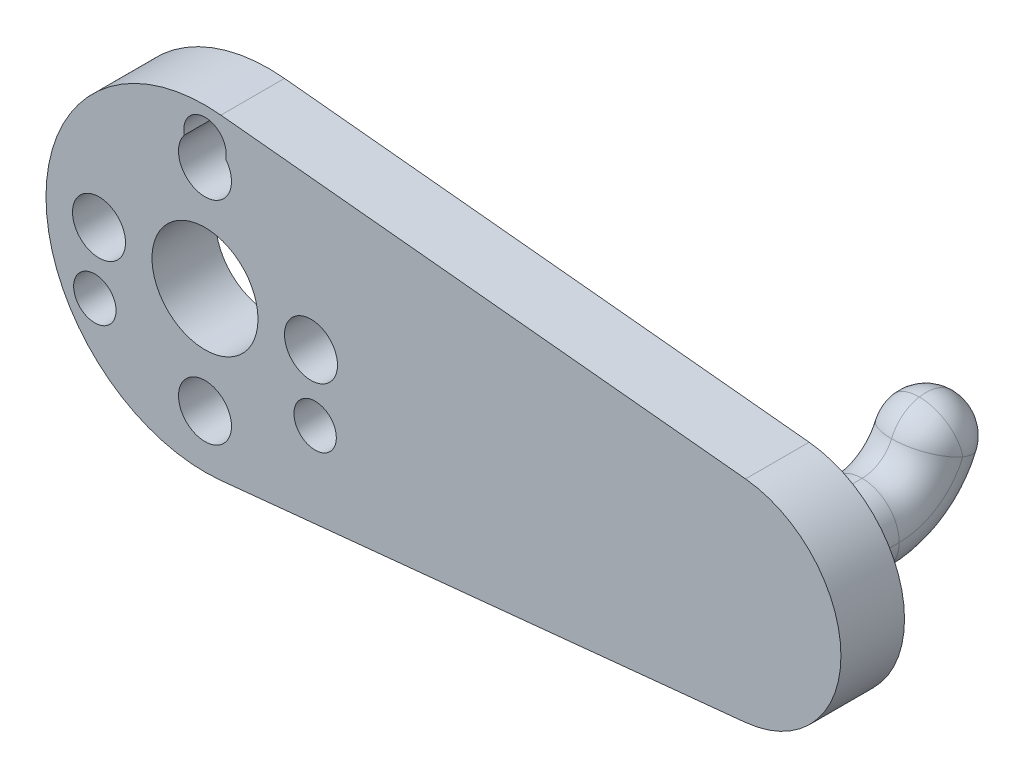
ISO-10303-21;
HEADER;
FILE_DESCRIPTION(('STEP AP214'),'2;1');
FILE_NAME('part.step','',(''),(''),'','','');
FILE_SCHEMA(('AUTOMOTIVE_DESIGN { 1 0 10303 214 1 1 1 1 }'));
ENDSEC;
DATA;
#1=APPLICATION_CONTEXT('core data for automotive mechanical design processes');
#2=APPLICATION_PROTOCOL_DEFINITION('international standard','automotive_design',2000,#1);
#3=PRODUCT_CONTEXT('',#1,'mechanical');
#4=PRODUCT('Part','Part','',(#3));
#5=PRODUCT_RELATED_PRODUCT_CATEGORY('part','',(#4));
#6=PRODUCT_DEFINITION_FORMATION('','',#4);
#7=PRODUCT_DEFINITION_CONTEXT('part definition',#1,'design');
#8=PRODUCT_DEFINITION('design','',#6,#7);
#9=PRODUCT_DEFINITION_SHAPE('','',#8);
#10=(LENGTH_UNIT() NAMED_UNIT(*) SI_UNIT(.MILLI.,.METRE.));
#11=(NAMED_UNIT(*) PLANE_ANGLE_UNIT() SI_UNIT($,.RADIAN.));
#12=(NAMED_UNIT(*) SI_UNIT($,.STERADIAN.) SOLID_ANGLE_UNIT());
#13=UNCERTAINTY_MEASURE_WITH_UNIT(LENGTH_MEASURE(1.E-05),#10,'distance_accuracy_value','');
#14=(GEOMETRIC_REPRESENTATION_CONTEXT(3) GLOBAL_UNCERTAINTY_ASSIGNED_CONTEXT((#13)) GLOBAL_UNIT_ASSIGNED_CONTEXT((#10,
#11,#12)) REPRESENTATION_CONTEXT('',''));
#15=CARTESIAN_POINT('',(0.,0.,0.));
#16=DIRECTION('',(0.,0.,1.));
#17=DIRECTION('',(1.,0.,0.));
#18=AXIS2_PLACEMENT_3D('',#15,#16,#17);
#19=CARTESIAN_POINT('',(0.,0.,0.));
#20=DIRECTION('',(0.,0.,1.));
#21=DIRECTION('',(1.,0.,0.));
#22=AXIS2_PLACEMENT_3D('',#19,#20,#21);
#23=PLANE('',#22);
#24=CARTESIAN_POINT('',(-5.1961524227065,-3.00000000000022,0.));
#25=DIRECTION('',(0.,0.,1.));
#26=DIRECTION('',(1.,0.,0.));
#27=AXIS2_PLACEMENT_3D('',#24,#25,#26);
#28=CIRCLE('',#27,1.00000000000048);
#29=CARTESIAN_POINT('',(-4.19615242270602,-3.00000000000022,0.));
#30=VERTEX_POINT('',#29);
#31=EDGE_CURVE('E243',#30,#30,#28,.T.);
#32=ORIENTED_EDGE('',*,*,#31,.T.);
#33=EDGE_LOOP('',(#32));
#34=FACE_BOUND('',#33,.T.);
#35=CARTESIAN_POINT('',(5.19615242270676,-2.99999999999978,0.));
#36=DIRECTION('',(0.,0.,1.));
#37=DIRECTION('',(1.,0.,0.));
#38=AXIS2_PLACEMENT_3D('',#35,#36,#37);
#39=CIRCLE('',#38,1.00000000000033);
#40=CARTESIAN_POINT('',(6.19615242270709,-2.99999999999978,0.));
#41=VERTEX_POINT('',#40);
#42=EDGE_CURVE('E251',#41,#41,#39,.T.);
#43=ORIENTED_EDGE('',*,*,#42,.T.);
#44=EDGE_LOOP('',(#43));
#45=FACE_BOUND('',#44,.T.);
#46=CARTESIAN_POINT('',(-2.54353829665099E-13,6.,0.));
#47=DIRECTION('',(0.,0.,1.));
#48=DIRECTION('',(1.,0.,0.));
#49=AXIS2_PLACEMENT_3D('',#46,#47,#48);
#50=CIRCLE('',#49,1.);
#51=CARTESIAN_POINT('',(0.975780937249551,5.78125000000024,0.));
#52=VERTEX_POINT('',#51);
#53=CARTESIAN_POINT('',(-0.975780937249948,5.78124999999975,0.));
#54=VERTEX_POINT('',#53);
#55=EDGE_CURVE('E257',#52,#54,#50,.T.);
#56=ORIENTED_EDGE('',*,*,#55,.T.);
#57=CARTESIAN_POINT('',(0.,5.,0.));
#58=DIRECTION('',(0.,0.,1.));
#59=DIRECTION('',(1.,0.,0.));
#60=AXIS2_PLACEMENT_3D('',#57,#58,#59);
#61=CIRCLE('',#60,1.25);
#62=EDGE_CURVE('E111',#54,#52,#61,.T.);
#63=ORIENTED_EDGE('',*,*,#62,.T.);
#64=EDGE_LOOP('',(#56,#63));
#65=FACE_BOUND('',#64,.T.);
#66=CARTESIAN_POINT('',(0.,0.,0.));
#67=DIRECTION('',(0.,0.,1.));
#68=DIRECTION('',(1.,0.,0.));
#69=AXIS2_PLACEMENT_3D('',#66,#67,#68);
#70=CIRCLE('',#69,7.5);
#71=CARTESIAN_POINT('',(0.75,7.46240577829965,0.));
#72=VERTEX_POINT('',#71);
#73=CARTESIAN_POINT('',(0.75,-7.46240577829965,0.));
#74=VERTEX_POINT('',#73);
#75=EDGE_CURVE('E294',#72,#74,#70,.T.);
#76=ORIENTED_EDGE('',*,*,#75,.F.);
#77=DIRECTION('',(-0.99498743710662,0.1,0.));
#78=VECTOR('',#77,1.);
#79=CARTESIAN_POINT('',(0.75,7.46240577829965,0.));
#80=LINE('',#79,#78);
#81=CARTESIAN_POINT('',(25.5,4.9749371855331,0.));
#82=VERTEX_POINT('',#81);
#83=EDGE_CURVE('E301',#82,#72,#80,.T.);
#84=ORIENTED_EDGE('',*,*,#83,.F.);
#85=CARTESIAN_POINT('',(25.,0.,0.));
#86=DIRECTION('',(0.,0.,1.));
#87=DIRECTION('',(1.,0.,0.));
#88=AXIS2_PLACEMENT_3D('',#85,#86,#87);
#89=CIRCLE('',#88,5.);
#90=CARTESIAN_POINT('',(25.5,-4.9749371855331,0.));
#91=VERTEX_POINT('',#90);
#92=EDGE_CURVE('E312',#91,#82,#89,.T.);
#93=ORIENTED_EDGE('',*,*,#92,.F.);
#94=DIRECTION('',(0.99498743710662,0.1,0.));
#95=VECTOR('',#94,1.);
#96=CARTESIAN_POINT('',(0.75,-7.46240577829965,0.));
#97=LINE('',#96,#95);
#98=EDGE_CURVE('E310',#74,#91,#97,.T.);
#99=ORIENTED_EDGE('',*,*,#98,.F.);
#100=EDGE_LOOP('',(#76,#84,#93,#99));
#101=FACE_BOUND('',#100,.T.);
#102=CARTESIAN_POINT('',(0.,0.,0.));
#103=DIRECTION('',(0.,0.,1.));
#104=DIRECTION('',(1.,0.,0.));
#105=AXIS2_PLACEMENT_3D('',#102,#103,#104);
#106=CIRCLE('',#105,2.5);
#107=CARTESIAN_POINT('',(2.5,0.,0.));
#108=VERTEX_POINT('',#107);
#109=EDGE_CURVE('E288',#108,#108,#106,.T.);
#110=ORIENTED_EDGE('',*,*,#109,.T.);
#111=EDGE_LOOP('',(#110));
#112=FACE_BOUND('',#111,.T.);
#113=CARTESIAN_POINT('',(5.00000000000014,1.42247325030098E-13,0.));
#114=DIRECTION('',(0.,0.,1.));
#115=DIRECTION('',(1.,0.,0.));
#116=AXIS2_PLACEMENT_3D('',#113,#114,#115);
#117=CIRCLE('',#116,1.25);
#118=CARTESIAN_POINT('',(6.25000000000014,1.42247325030098E-13,0.));
#119=VERTEX_POINT('',#118);
#120=EDGE_CURVE('E282',#119,#119,#117,.T.);
#121=ORIENTED_EDGE('',*,*,#120,.T.);
#122=EDGE_LOOP('',(#121));
#123=FACE_BOUND('',#122,.T.);
#124=CARTESIAN_POINT('',(2.84494650060196E-13,-5.,0.));
#125=DIRECTION('',(0.,0.,1.));
#126=DIRECTION('',(1.,0.,0.));
#127=AXIS2_PLACEMENT_3D('',#124,#125,#126);
#128=CIRCLE('',#127,1.25);
#129=CARTESIAN_POINT('',(1.25000000000028,-5.,0.));
#130=VERTEX_POINT('',#129);
#131=EDGE_CURVE('E276',#130,#130,#128,.T.);
#132=ORIENTED_EDGE('',*,*,#131,.T.);
#133=EDGE_LOOP('',(#132));
#134=FACE_BOUND('',#133,.T.);
#135=CARTESIAN_POINT('',(-4.99999999999986,-1.42247325030098E-13,0.));
#136=DIRECTION('',(0.,0.,1.));
#137=DIRECTION('',(1.,0.,0.));
#138=AXIS2_PLACEMENT_3D('',#135,#136,#137);
#139=CIRCLE('',#138,1.25);
#140=CARTESIAN_POINT('',(-3.74999999999986,-1.42247325030098E-13,0.));
#141=VERTEX_POINT('',#140);
#142=EDGE_CURVE('E272',#141,#141,#139,.T.);
#143=ORIENTED_EDGE('',*,*,#142,.T.);
#144=EDGE_LOOP('',(#143));
#145=FACE_BOUND('',#144,.T.);
#146=CARTESIAN_POINT('',(25.,0.,0.));
#147=DIRECTION('',(0.,0.,1.));
#148=DIRECTION('',(1.,0.,0.));
#149=AXIS2_PLACEMENT_3D('',#146,#147,#148);
#150=CIRCLE('',#149,3.5);
#151=CARTESIAN_POINT('',(25.,-3.5,0.));
#152=VERTEX_POINT('',#151);
#153=CARTESIAN_POINT('',(21.5,0.,0.));
#154=VERTEX_POINT('',#153);
#155=EDGE_CURVE('E11',#152,#154,#150,.F.);
#156=ORIENTED_EDGE('',*,*,#155,.F.);
#157=CARTESIAN_POINT('',(25.,0.,0.));
#158=DIRECTION('',(0.,0.,1.));
#159=DIRECTION('',(1.,0.,0.));
#160=AXIS2_PLACEMENT_3D('',#157,#158,#159);
#161=CIRCLE('',#160,3.5);
#162=CARTESIAN_POINT('',(28.5,0.,0.));
#163=VERTEX_POINT('',#162);
#164=EDGE_CURVE('E45',#163,#152,#161,.F.);
#165=ORIENTED_EDGE('',*,*,#164,.F.);
#166=CARTESIAN_POINT('',(25.,0.,0.));
#167=DIRECTION('',(0.,0.,1.));
#168=DIRECTION('',(1.,0.,0.));
#169=AXIS2_PLACEMENT_3D('',#166,#167,#168);
#170=CIRCLE('',#169,3.5);
#171=CARTESIAN_POINT('',(25.,3.5,0.));
#172=VERTEX_POINT('',#171);
#173=EDGE_CURVE('E152',#172,#163,#170,.F.);
#174=ORIENTED_EDGE('',*,*,#173,.F.);
#175=CARTESIAN_POINT('',(25.,0.,0.));
#176=DIRECTION('',(0.,0.,1.));
#177=DIRECTION('',(1.,0.,0.));
#178=AXIS2_PLACEMENT_3D('',#175,#176,#177);
#179=CIRCLE('',#178,3.5);
#180=EDGE_CURVE('E155',#154,#172,#179,.F.);
#181=ORIENTED_EDGE('',*,*,#180,.F.);
#182=EDGE_LOOP('',(#156,#165,#174,#181));
#183=FACE_BOUND('',#182,.T.);
#184=ADVANCED_FACE('F35',(#34,#45,#65,#101,#112,#123,#134,#145,#183),#23,.F.);
#185=CARTESIAN_POINT('',(0.,0.,3.));
#186=DIRECTION('',(0.,0.,1.));
#187=DIRECTION('',(1.,0.,0.));
#188=AXIS2_PLACEMENT_3D('',#185,#186,#187);
#189=PLANE('',#188);
#190=CARTESIAN_POINT('',(5.19615242270676,-2.99999999999978,3.));
#191=DIRECTION('',(0.,0.,1.));
#192=DIRECTION('',(1.,0.,0.));
#193=AXIS2_PLACEMENT_3D('',#190,#191,#192);
#194=CIRCLE('',#193,1.00000000000033);
#195=CARTESIAN_POINT('',(6.19615242270709,-2.99999999999978,3.));
#196=VERTEX_POINT('',#195);
#197=EDGE_CURVE('E254',#196,#196,#194,.T.);
#198=ORIENTED_EDGE('',*,*,#197,.F.);
#199=EDGE_LOOP('',(#198));
#200=FACE_BOUND('',#199,.T.);
#201=CARTESIAN_POINT('',(2.84494650060196E-13,-5.,3.));
#202=DIRECTION('',(0.,0.,1.));
#203=DIRECTION('',(1.,0.,0.));
#204=AXIS2_PLACEMENT_3D('',#201,#202,#203);
#205=CIRCLE('',#204,1.25);
#206=CARTESIAN_POINT('',(1.25000000000028,-5.,3.));
#207=VERTEX_POINT('',#206);
#208=EDGE_CURVE('E279',#207,#207,#205,.T.);
#209=ORIENTED_EDGE('',*,*,#208,.F.);
#210=EDGE_LOOP('',(#209));
#211=FACE_BOUND('',#210,.T.);
#212=CARTESIAN_POINT('',(0.,0.,3.));
#213=DIRECTION('',(0.,0.,1.));
#214=DIRECTION('',(1.,0.,0.));
#215=AXIS2_PLACEMENT_3D('',#212,#213,#214);
#216=CIRCLE('',#215,2.5);
#217=CARTESIAN_POINT('',(2.5,0.,3.));
#218=VERTEX_POINT('',#217);
#219=EDGE_CURVE('E291',#218,#218,#216,.T.);
#220=ORIENTED_EDGE('',*,*,#219,.F.);
#221=EDGE_LOOP('',(#220));
#222=FACE_BOUND('',#221,.T.);
#223=CARTESIAN_POINT('',(0.,0.,3.));
#224=DIRECTION('',(0.,0.,1.));
#225=DIRECTION('',(1.,0.,0.));
#226=AXIS2_PLACEMENT_3D('',#223,#224,#225);
#227=CIRCLE('',#226,7.5);
#228=CARTESIAN_POINT('',(0.75,7.46240577829965,3.));
#229=VERTEX_POINT('',#228);
#230=CARTESIAN_POINT('',(0.75,-7.46240577829965,3.));
#231=VERTEX_POINT('',#230);
#232=EDGE_CURVE('E297',#229,#231,#227,.T.);
#233=ORIENTED_EDGE('',*,*,#232,.T.);
#234=DIRECTION('',(0.99498743710662,0.1,0.));
#235=VECTOR('',#234,1.);
#236=CARTESIAN_POINT('',(0.75,-7.46240577829965,3.));
#237=LINE('',#236,#235);
#238=CARTESIAN_POINT('',(25.5,-4.9749371855331,3.));
#239=VERTEX_POINT('',#238);
#240=EDGE_CURVE('E300',#231,#239,#237,.T.);
#241=ORIENTED_EDGE('',*,*,#240,.T.);
#242=CARTESIAN_POINT('',(25.,0.,3.));
#243=DIRECTION('',(0.,0.,1.));
#244=DIRECTION('',(1.,0.,0.));
#245=AXIS2_PLACEMENT_3D('',#242,#243,#244);
#246=CIRCLE('',#245,5.);
#247=CARTESIAN_POINT('',(25.5,4.9749371855331,3.));
#248=VERTEX_POINT('',#247);
#249=EDGE_CURVE('E303',#239,#248,#246,.T.);
#250=ORIENTED_EDGE('',*,*,#249,.T.);
#251=DIRECTION('',(-0.99498743710662,0.1,0.));
#252=VECTOR('',#251,1.);
#253=CARTESIAN_POINT('',(0.75,7.46240577829965,3.));
#254=LINE('',#253,#252);
#255=EDGE_CURVE('E305',#248,#229,#254,.T.);
#256=ORIENTED_EDGE('',*,*,#255,.T.);
#257=EDGE_LOOP('',(#233,#241,#250,#256));
#258=FACE_BOUND('',#257,.T.);
#259=CARTESIAN_POINT('',(5.00000000000014,1.42247325030098E-13,3.));
#260=DIRECTION('',(0.,0.,1.));
#261=DIRECTION('',(1.,0.,0.));
#262=AXIS2_PLACEMENT_3D('',#259,#260,#261);
#263=CIRCLE('',#262,1.25);
#264=CARTESIAN_POINT('',(6.25000000000014,1.42247325030098E-13,3.));
#265=VERTEX_POINT('',#264);
#266=EDGE_CURVE('E285',#265,#265,#263,.T.);
#267=ORIENTED_EDGE('',*,*,#266,.F.);
#268=EDGE_LOOP('',(#267));
#269=FACE_BOUND('',#268,.T.);
#270=CARTESIAN_POINT('',(-4.99999999999986,-1.42247325030098E-13,3.));
#271=DIRECTION('',(0.,0.,1.));
#272=DIRECTION('',(1.,0.,0.));
#273=AXIS2_PLACEMENT_3D('',#270,#271,#272);
#274=CIRCLE('',#273,1.25);
#275=CARTESIAN_POINT('',(-3.74999999999986,-1.42247325030098E-13,3.));
#276=VERTEX_POINT('',#275);
#277=EDGE_CURVE('E273',#276,#276,#274,.T.);
#278=ORIENTED_EDGE('',*,*,#277,.F.);
#279=EDGE_LOOP('',(#278));
#280=FACE_BOUND('',#279,.T.);
#281=CARTESIAN_POINT('',(0.,5.,3.));
#282=DIRECTION('',(0.,0.,1.));
#283=DIRECTION('',(1.,0.,0.));
#284=AXIS2_PLACEMENT_3D('',#281,#282,#283);
#285=CIRCLE('',#284,1.25);
#286=CARTESIAN_POINT('',(-0.975780937249948,5.78124999999975,3.));
#287=VERTEX_POINT('',#286);
#288=CARTESIAN_POINT('',(0.975780937249551,5.78125000000024,3.));
#289=VERTEX_POINT('',#288);
#290=EDGE_CURVE('E263',#287,#289,#285,.T.);
#291=ORIENTED_EDGE('',*,*,#290,.F.);
#292=CARTESIAN_POINT('',(-2.54353829665099E-13,6.,3.));
#293=DIRECTION('',(0.,0.,1.));
#294=DIRECTION('',(1.,0.,0.));
#295=AXIS2_PLACEMENT_3D('',#292,#293,#294);
#296=CIRCLE('',#295,1.);
#297=EDGE_CURVE('E260',#289,#287,#296,.T.);
#298=ORIENTED_EDGE('',*,*,#297,.F.);
#299=EDGE_LOOP('',(#291,#298));
#300=FACE_BOUND('',#299,.T.);
#301=CARTESIAN_POINT('',(-5.1961524227065,-3.00000000000022,3.));
#302=DIRECTION('',(0.,0.,1.));
#303=DIRECTION('',(1.,0.,0.));
#304=AXIS2_PLACEMENT_3D('',#301,#302,#303);
#305=CIRCLE('',#304,1.00000000000048);
#306=CARTESIAN_POINT('',(-4.19615242270602,-3.00000000000022,3.));
#307=VERTEX_POINT('',#306);
#308=EDGE_CURVE('E246',#307,#307,#305,.T.);
#309=ORIENTED_EDGE('',*,*,#308,.F.);
#310=EDGE_LOOP('',(#309));
#311=FACE_BOUND('',#310,.T.);
#312=ADVANCED_FACE('F340',(#200,#211,#222,#258,#269,#280,#300,#311),#189,.T.);
#313=CARTESIAN_POINT('',(0.,0.,3.));
#314=DIRECTION('',(0.,0.,-1.));
#315=DIRECTION('',(-1.,0.,0.));
#316=AXIS2_PLACEMENT_3D('',#313,#314,#315);
#317=CYLINDRICAL_SURFACE('',#316,7.5);
#318=ORIENTED_EDGE('',*,*,#75,.T.);
#319=DIRECTION('',(0.,0.,-1.));
#320=VECTOR('',#319,1.);
#321=CARTESIAN_POINT('',(0.75,-7.46240577829965,3.));
#322=LINE('',#321,#320);
#323=EDGE_CURVE('E170',#231,#74,#322,.T.);
#324=ORIENTED_EDGE('',*,*,#323,.F.);
#325=ORIENTED_EDGE('',*,*,#232,.F.);
#326=DIRECTION('',(0.,0.,-1.));
#327=VECTOR('',#326,1.);
#328=CARTESIAN_POINT('',(0.75,7.46240577829965,3.));
#329=LINE('',#328,#327);
#330=EDGE_CURVE('E307',#229,#72,#329,.T.);
#331=ORIENTED_EDGE('',*,*,#330,.T.);
#332=EDGE_LOOP('',(#318,#324,#325,#331));
#333=FACE_BOUND('',#332,.T.);
#334=ADVANCED_FACE('F337',(#333),#317,.T.);
#335=CARTESIAN_POINT('',(0.75,-7.46240577829965,3.));
#336=DIRECTION('',(-0.1,0.99498743710662,0.));
#337=DIRECTION('',(-0.99498743710662,-0.1,0.));
#338=AXIS2_PLACEMENT_3D('',#335,#336,#337);
#339=PLANE('',#338);
#340=ORIENTED_EDGE('',*,*,#98,.T.);
#341=DIRECTION('',(0.,0.,-1.));
#342=VECTOR('',#341,1.);
#343=CARTESIAN_POINT('',(25.5,-4.9749371855331,3.));
#344=LINE('',#343,#342);
#345=EDGE_CURVE('E174',#239,#91,#344,.T.);
#346=ORIENTED_EDGE('',*,*,#345,.F.);
#347=ORIENTED_EDGE('',*,*,#240,.F.);
#348=ORIENTED_EDGE('',*,*,#323,.T.);
#349=EDGE_LOOP('',(#340,#346,#347,#348));
#350=FACE_BOUND('',#349,.T.);
#351=ADVANCED_FACE('F342',(#350),#339,.F.);
#352=CARTESIAN_POINT('',(25.,0.,3.));
#353=DIRECTION('',(0.,0.,-1.));
#354=DIRECTION('',(-1.,0.,0.));
#355=AXIS2_PLACEMENT_3D('',#352,#353,#354);
#356=CYLINDRICAL_SURFACE('',#355,5.);
#357=ORIENTED_EDGE('',*,*,#92,.T.);
#358=DIRECTION('',(0.,0.,-1.));
#359=VECTOR('',#358,1.);
#360=CARTESIAN_POINT('',(25.5,4.9749371855331,3.));
#361=LINE('',#360,#359);
#362=EDGE_CURVE('E317',#248,#82,#361,.T.);
#363=ORIENTED_EDGE('',*,*,#362,.F.);
#364=ORIENTED_EDGE('',*,*,#249,.F.);
#365=ORIENTED_EDGE('',*,*,#345,.T.);
#366=EDGE_LOOP('',(#357,#363,#364,#365));
#367=FACE_BOUND('',#366,.T.);
#368=ADVANCED_FACE('F324',(#367),#356,.T.);
#369=CARTESIAN_POINT('',(0.75,7.46240577829965,3.));
#370=DIRECTION('',(-0.1,-0.99498743710662,0.));
#371=DIRECTION('',(0.99498743710662,-0.1,0.));
#372=AXIS2_PLACEMENT_3D('',#369,#370,#371);
#373=PLANE('',#372);
#374=ORIENTED_EDGE('',*,*,#83,.T.);
#375=ORIENTED_EDGE('',*,*,#330,.F.);
#376=ORIENTED_EDGE('',*,*,#255,.F.);
#377=ORIENTED_EDGE('',*,*,#362,.T.);
#378=EDGE_LOOP('',(#374,#375,#376,#377));
#379=FACE_BOUND('',#378,.T.);
#380=ADVANCED_FACE('F333',(#379),#373,.F.);
#381=CARTESIAN_POINT('',(0.,0.,3.));
#382=DIRECTION('',(0.,0.,-1.));
#383=DIRECTION('',(-1.,0.,0.));
#384=AXIS2_PLACEMENT_3D('',#381,#382,#383);
#385=CYLINDRICAL_SURFACE('',#384,2.5);
#386=ORIENTED_EDGE('',*,*,#219,.T.);
#387=EDGE_LOOP('',(#386));
#388=FACE_BOUND('',#387,.T.);
#389=ORIENTED_EDGE('',*,*,#109,.F.);
#390=EDGE_LOOP('',(#389));
#391=FACE_BOUND('',#390,.T.);
#392=ADVANCED_FACE('F362',(#388,#391),#385,.F.);
#393=CARTESIAN_POINT('',(5.00000000000014,1.42247325030098E-13,3.));
#394=DIRECTION('',(0.,0.,-1.));
#395=DIRECTION('',(-1.,0.,0.));
#396=AXIS2_PLACEMENT_3D('',#393,#394,#395);
#397=CYLINDRICAL_SURFACE('',#396,1.25);
#398=ORIENTED_EDGE('',*,*,#266,.T.);
#399=EDGE_LOOP('',(#398));
#400=FACE_BOUND('',#399,.T.);
#401=ORIENTED_EDGE('',*,*,#120,.F.);
#402=EDGE_LOOP('',(#401));
#403=FACE_BOUND('',#402,.T.);
#404=ADVANCED_FACE('F366',(#400,#403),#397,.F.);
#405=CARTESIAN_POINT('',(2.84494650060196E-13,-5.,3.));
#406=DIRECTION('',(0.,0.,-1.));
#407=DIRECTION('',(-1.,0.,0.));
#408=AXIS2_PLACEMENT_3D('',#405,#406,#407);
#409=CYLINDRICAL_SURFACE('',#408,1.25);
#410=ORIENTED_EDGE('',*,*,#208,.T.);
#411=EDGE_LOOP('',(#410));
#412=FACE_BOUND('',#411,.T.);
#413=ORIENTED_EDGE('',*,*,#131,.F.);
#414=EDGE_LOOP('',(#413));
#415=FACE_BOUND('',#414,.T.);
#416=ADVANCED_FACE('F371',(#412,#415),#409,.F.);
#417=CARTESIAN_POINT('',(-4.99999999999986,-1.42247325030098E-13,3.));
#418=DIRECTION('',(0.,0.,-1.));
#419=DIRECTION('',(-1.,0.,0.));
#420=AXIS2_PLACEMENT_3D('',#417,#418,#419);
#421=CYLINDRICAL_SURFACE('',#420,1.25);
#422=ORIENTED_EDGE('',*,*,#277,.T.);
#423=EDGE_LOOP('',(#422));
#424=FACE_BOUND('',#423,.T.);
#425=ORIENTED_EDGE('',*,*,#142,.F.);
#426=EDGE_LOOP('',(#425));
#427=FACE_BOUND('',#426,.T.);
#428=ADVANCED_FACE('F378',(#424,#427),#421,.F.);
#429=CARTESIAN_POINT('',(-2.54353829665099E-13,6.,3.));
#430=DIRECTION('',(0.,0.,-1.));
#431=DIRECTION('',(-1.,0.,0.));
#432=AXIS2_PLACEMENT_3D('',#429,#430,#431);
#433=CYLINDRICAL_SURFACE('',#432,1.);
#434=ORIENTED_EDGE('',*,*,#55,.F.);
#435=DIRECTION('',(0.,0.,-1.));
#436=VECTOR('',#435,1.);
#437=CARTESIAN_POINT('',(0.975780937249551,5.78125000000024,3.));
#438=LINE('',#437,#436);
#439=EDGE_CURVE('E265',#289,#52,#438,.T.);
#440=ORIENTED_EDGE('',*,*,#439,.F.);
#441=ORIENTED_EDGE('',*,*,#297,.T.);
#442=DIRECTION('',(0.,0.,-1.));
#443=VECTOR('',#442,1.);
#444=CARTESIAN_POINT('',(-0.975780937249948,5.78124999999975,3.));
#445=LINE('',#444,#443);
#446=EDGE_CURVE('E270',#287,#54,#445,.T.);
#447=ORIENTED_EDGE('',*,*,#446,.T.);
#448=EDGE_LOOP('',(#434,#440,#441,#447));
#449=FACE_BOUND('',#448,.T.);
#450=ADVANCED_FACE('F382',(#449),#433,.F.);
#451=CARTESIAN_POINT('',(0.,5.,3.));
#452=DIRECTION('',(0.,0.,-1.));
#453=DIRECTION('',(-1.,0.,0.));
#454=AXIS2_PLACEMENT_3D('',#451,#452,#453);
#455=CYLINDRICAL_SURFACE('',#454,1.25);
#456=ORIENTED_EDGE('',*,*,#62,.F.);
#457=ORIENTED_EDGE('',*,*,#446,.F.);
#458=ORIENTED_EDGE('',*,*,#290,.T.);
#459=ORIENTED_EDGE('',*,*,#439,.T.);
#460=EDGE_LOOP('',(#456,#457,#458,#459));
#461=FACE_BOUND('',#460,.T.);
#462=ADVANCED_FACE('F386',(#461),#455,.F.);
#463=CARTESIAN_POINT('',(5.19615242270676,-2.99999999999978,3.));
#464=DIRECTION('',(0.,0.,-1.));
#465=DIRECTION('',(-1.,0.,0.));
#466=AXIS2_PLACEMENT_3D('',#463,#464,#465);
#467=CYLINDRICAL_SURFACE('',#466,1.00000000000033);
#468=ORIENTED_EDGE('',*,*,#197,.T.);
#469=EDGE_LOOP('',(#468));
#470=FACE_BOUND('',#469,.T.);
#471=ORIENTED_EDGE('',*,*,#42,.F.);
#472=EDGE_LOOP('',(#471));
#473=FACE_BOUND('',#472,.T.);
#474=ADVANCED_FACE('F390',(#470,#473),#467,.F.);
#475=CARTESIAN_POINT('',(-5.1961524227065,-3.00000000000022,3.));
#476=DIRECTION('',(0.,0.,-1.));
#477=DIRECTION('',(-1.,0.,0.));
#478=AXIS2_PLACEMENT_3D('',#475,#476,#477);
#479=CYLINDRICAL_SURFACE('',#478,1.00000000000048);
#480=ORIENTED_EDGE('',*,*,#308,.T.);
#481=EDGE_LOOP('',(#480));
#482=FACE_BOUND('',#481,.T.);
#483=ORIENTED_EDGE('',*,*,#31,.F.);
#484=EDGE_LOOP('',(#483));
#485=FACE_BOUND('',#484,.T.);
#486=ADVANCED_FACE('F393',(#482,#485),#479,.F.);
#487=CARTESIAN_POINT('',(25.,2.00214155211783,-6.00089141657093));
#488=DIRECTION('',(1.,0.,0.));
#489=DIRECTION('',(0.,0.,-1.));
#490=AXIS2_PLACEMENT_3D('',#487,#488,#489);
#491=SPHERICAL_SURFACE('',#490,1.75);
#492=CARTESIAN_POINT('',(25.,2.00214155211783,-6.00089141657093));
#493=DIRECTION('',(0.,-0.173648177666924,0.984807753012209));
#494=DIRECTION('',(0.,-0.984807753012209,-0.173648177666924));
#495=AXIS2_PLACEMENT_3D('',#492,#493,#494);
#496=CIRCLE('',#495,1.75);
#497=CARTESIAN_POINT('',(26.75,2.00214155211783,-6.00089141657093));
#498=VERTEX_POINT('',#497);
#499=CARTESIAN_POINT('',(25.,3.72555511988919,-5.69700710565382));
#500=VERTEX_POINT('',#499);
#501=EDGE_CURVE('E39',#498,#500,#496,.T.);
#502=ORIENTED_EDGE('',*,*,#501,.T.);
#503=CARTESIAN_POINT('',(25.,2.00214155211783,-6.00089141657093));
#504=DIRECTION('',(-1.,0.,0.));
#505=DIRECTION('',(0.,0.,1.));
#506=AXIS2_PLACEMENT_3D('',#503,#504,#505);
#507=CIRCLE('',#506,1.75);
#508=CARTESIAN_POINT('',(25.,2.67406533174669,-4.38502680764812));
#509=VERTEX_POINT('',#508);
#510=EDGE_CURVE('E102',#509,#500,#507,.T.);
#511=ORIENTED_EDGE('',*,*,#510,.F.);
#512=CARTESIAN_POINT('',(25.,2.00214155211783,-6.00089141657093));
#513=DIRECTION('',(0.,0.923351205098748,-0.383956445502207));
#514=DIRECTION('',(0.,0.383956445502207,0.923351205098748));
#515=AXIS2_PLACEMENT_3D('',#512,#513,#514);
#516=CIRCLE('',#515,1.75);
#517=EDGE_CURVE('E235',#498,#509,#516,.F.);
#518=ORIENTED_EDGE('',*,*,#517,.F.);
#519=EDGE_LOOP('',(#502,#511,#518));
#520=FACE_BOUND('',#519,.T.);
#521=ADVANCED_FACE('F37',(#520),#491,.T.);
#522=CARTESIAN_POINT('',(25.,2.00214155211783,-6.00089141657093));
#523=DIRECTION('',(1.,0.,0.));
#524=DIRECTION('',(0.,1.,0.));
#525=AXIS2_PLACEMENT_3D('',#522,#523,#524);
#526=SPHERICAL_SURFACE('',#525,1.75);
#527=CARTESIAN_POINT('',(25.,2.00214155211783,-6.00089141657093));
#528=DIRECTION('',(1.,0.,0.));
#529=DIRECTION('',(0.,0.,-1.));
#530=AXIS2_PLACEMENT_3D('',#527,#528,#529);
#531=CIRCLE('',#530,1.75);
#532=CARTESIAN_POINT('',(25.,1.33021777248897,-7.61675602549374));
#533=VERTEX_POINT('',#532);
#534=EDGE_CURVE('E238',#500,#533,#531,.F.);
#535=ORIENTED_EDGE('',*,*,#534,.F.);
#536=ORIENTED_EDGE('',*,*,#501,.F.);
#537=CARTESIAN_POINT('',(25.,2.00214155211783,-6.00089141657093));
#538=DIRECTION('',(0.,0.923351205098749,-0.383956445502207));
#539=DIRECTION('',(0.,0.383956445502207,0.923351205098749));
#540=AXIS2_PLACEMENT_3D('',#537,#538,#539);
#541=CIRCLE('',#540,1.75);
#542=EDGE_CURVE('E230',#533,#498,#541,.F.);
#543=ORIENTED_EDGE('',*,*,#542,.F.);
#544=EDGE_LOOP('',(#535,#536,#543));
#545=FACE_BOUND('',#544,.T.);
#546=ADVANCED_FACE('F400',(#545),#526,.T.);
#547=CARTESIAN_POINT('',(25.,2.00214155211783,-6.00089141657093));
#548=DIRECTION('',(-1.,0.,0.));
#549=DIRECTION('',(0.,0.,1.));
#550=AXIS2_PLACEMENT_3D('',#547,#548,#549);
#551=SPHERICAL_SURFACE('',#550,1.75);
#552=ORIENTED_EDGE('',*,*,#510,.T.);
#553=CARTESIAN_POINT('',(25.,2.00214155211783,-6.00089141657093));
#554=DIRECTION('',(0.,0.173648177666923,-0.984807753012209));
#555=DIRECTION('',(0.,0.984807753012209,0.173648177666923));
#556=AXIS2_PLACEMENT_3D('',#553,#554,#555);
#557=CIRCLE('',#556,1.75);
#558=CARTESIAN_POINT('',(23.25,2.00214155211783,-6.00089141657093));
#559=VERTEX_POINT('',#558);
#560=EDGE_CURVE('E228',#559,#500,#557,.T.);
#561=ORIENTED_EDGE('',*,*,#560,.F.);
#562=CARTESIAN_POINT('',(25.,2.00214155211783,-6.00089141657093));
#563=DIRECTION('',(0.,0.923351205098748,-0.383956445502207));
#564=DIRECTION('',(0.,0.383956445502207,0.923351205098749));
#565=AXIS2_PLACEMENT_3D('',#562,#563,#564);
#566=CIRCLE('',#565,1.75);
#567=EDGE_CURVE('E225',#509,#559,#566,.F.);
#568=ORIENTED_EDGE('',*,*,#567,.F.);
#569=EDGE_LOOP('',(#552,#561,#568));
#570=FACE_BOUND('',#569,.T.);
#571=ADVANCED_FACE('F407',(#570),#551,.T.);
#572=CARTESIAN_POINT('',(25.,3.25,-3.));
#573=DIRECTION('',(1.,0.,0.));
#574=DIRECTION('',(0.,0.,-1.));
#575=AXIS2_PLACEMENT_3D('',#572,#573,#574);
#576=TOROIDAL_SURFACE('',#575,3.25,1.75);
#577=CARTESIAN_POINT('',(26.75,3.25,-3.));
#578=DIRECTION('',(1.,0.,0.));
#579=DIRECTION('',(0.,0.,-1.));
#580=AXIS2_PLACEMENT_3D('',#577,#578,#579);
#581=CIRCLE('',#580,3.25);
#582=CARTESIAN_POINT('',(26.75,0.,-3.));
#583=VERTEX_POINT('',#582);
#584=EDGE_CURVE('E233',#498,#583,#581,.F.);
#585=ORIENTED_EDGE('',*,*,#584,.F.);
#586=ORIENTED_EDGE('',*,*,#517,.T.);
#587=CARTESIAN_POINT('',(25.,3.25,-3.));
#588=DIRECTION('',(1.,0.,0.));
#589=DIRECTION('',(0.,0.,-1.));
#590=AXIS2_PLACEMENT_3D('',#587,#588,#589);
#591=CIRCLE('',#590,1.5);
#592=CARTESIAN_POINT('',(25.,1.75,-3.));
#593=VERTEX_POINT('',#592);
#594=EDGE_CURVE('E222',#593,#509,#591,.T.);
#595=ORIENTED_EDGE('',*,*,#594,.F.);
#596=CARTESIAN_POINT('',(25.,0.,-3.));
#597=DIRECTION('',(0.,0.,1.));
#598=DIRECTION('',(1.,0.,0.));
#599=AXIS2_PLACEMENT_3D('',#596,#597,#598);
#600=CIRCLE('',#599,1.75);
#601=EDGE_CURVE('E219',#583,#593,#600,.T.);
#602=ORIENTED_EDGE('',*,*,#601,.F.);
#603=EDGE_LOOP('',(#585,#586,#595,#602));
#604=FACE_BOUND('',#603,.T.);
#605=ADVANCED_FACE('F411',(#604),#576,.T.);
#606=CARTESIAN_POINT('',(25.,3.25,-3.));
#607=DIRECTION('',(1.,0.,0.));
#608=DIRECTION('',(0.,0.,-1.));
#609=AXIS2_PLACEMENT_3D('',#606,#607,#608);
#610=TOROIDAL_SURFACE('',#609,3.25,1.75);
#611=ORIENTED_EDGE('',*,*,#542,.T.);
#612=ORIENTED_EDGE('',*,*,#584,.T.);
#613=CARTESIAN_POINT('',(25.,0.,-3.));
#614=DIRECTION('',(0.,0.,1.));
#615=DIRECTION('',(0.,-1.,0.));
#616=AXIS2_PLACEMENT_3D('',#613,#614,#615);
#617=CIRCLE('',#616,1.75);
#618=CARTESIAN_POINT('',(25.,-1.75,-3.));
#619=VERTEX_POINT('',#618);
#620=EDGE_CURVE('E212',#619,#583,#617,.T.);
#621=ORIENTED_EDGE('',*,*,#620,.F.);
#622=CARTESIAN_POINT('',(25.,3.25,-3.));
#623=DIRECTION('',(1.,0.,0.));
#624=DIRECTION('',(0.,0.,-1.));
#625=AXIS2_PLACEMENT_3D('',#622,#623,#624);
#626=CIRCLE('',#625,5.);
#627=EDGE_CURVE('E209',#533,#619,#626,.F.);
#628=ORIENTED_EDGE('',*,*,#627,.F.);
#629=EDGE_LOOP('',(#611,#612,#621,#628));
#630=FACE_BOUND('',#629,.T.);
#631=ADVANCED_FACE('F416',(#630),#610,.T.);
#632=CARTESIAN_POINT('',(25.,2.00214155211783,-6.00089141657093));
#633=DIRECTION('',(-1.,0.,0.));
#634=DIRECTION('',(0.,0.,1.));
#635=AXIS2_PLACEMENT_3D('',#632,#633,#634);
#636=SPHERICAL_SURFACE('',#635,1.75);
#637=ORIENTED_EDGE('',*,*,#560,.T.);
#638=ORIENTED_EDGE('',*,*,#534,.T.);
#639=CARTESIAN_POINT('',(25.,2.00214155211783,-6.00089141657093));
#640=DIRECTION('',(0.,0.923351205098749,-0.383956445502206));
#641=DIRECTION('',(0.,0.383956445502206,0.923351205098749));
#642=AXIS2_PLACEMENT_3D('',#639,#640,#641);
#643=CIRCLE('',#642,1.75);
#644=EDGE_CURVE('E206',#559,#533,#643,.F.);
#645=ORIENTED_EDGE('',*,*,#644,.F.);
#646=EDGE_LOOP('',(#637,#638,#645));
#647=FACE_BOUND('',#646,.T.);
#648=ADVANCED_FACE('F420',(#647),#636,.T.);
#649=CARTESIAN_POINT('',(25.,3.25,-3.));
#650=DIRECTION('',(1.,0.,0.));
#651=DIRECTION('',(0.,0.,-1.));
#652=AXIS2_PLACEMENT_3D('',#649,#650,#651);
#653=TOROIDAL_SURFACE('',#652,3.25,1.75);
#654=ORIENTED_EDGE('',*,*,#594,.T.);
#655=ORIENTED_EDGE('',*,*,#567,.T.);
#656=CARTESIAN_POINT('',(23.25,3.25,-3.));
#657=DIRECTION('',(1.,0.,0.));
#658=DIRECTION('',(0.,0.,-1.));
#659=AXIS2_PLACEMENT_3D('',#656,#657,#658);
#660=CIRCLE('',#659,3.25);
#661=CARTESIAN_POINT('',(23.25,0.,-3.));
#662=VERTEX_POINT('',#661);
#663=EDGE_CURVE('E203',#662,#559,#660,.T.);
#664=ORIENTED_EDGE('',*,*,#663,.F.);
#665=CARTESIAN_POINT('',(25.,0.,-3.));
#666=DIRECTION('',(0.,0.,1.));
#667=DIRECTION('',(1.,0.,0.));
#668=AXIS2_PLACEMENT_3D('',#665,#666,#667);
#669=CIRCLE('',#668,1.75);
#670=EDGE_CURVE('E200',#593,#662,#669,.T.);
#671=ORIENTED_EDGE('',*,*,#670,.F.);
#672=EDGE_LOOP('',(#654,#655,#664,#671));
#673=FACE_BOUND('',#672,.T.);
#674=ADVANCED_FACE('F424',(#673),#653,.T.);
#675=CARTESIAN_POINT('',(25.,0.,-3.));
#676=DIRECTION('',(0.,0.,-1.));
#677=DIRECTION('',(0.,1.,0.));
#678=AXIS2_PLACEMENT_3D('',#675,#676,#677);
#679=CYLINDRICAL_SURFACE('',#678,1.75);
#680=CARTESIAN_POINT('',(25.,0.,-1.75));
#681=DIRECTION('',(0.,0.,1.));
#682=DIRECTION('',(1.,0.,0.));
#683=AXIS2_PLACEMENT_3D('',#680,#681,#682);
#684=CIRCLE('',#683,1.75);
#685=CARTESIAN_POINT('',(26.75,0.,-1.75));
#686=VERTEX_POINT('',#685);
#687=CARTESIAN_POINT('',(25.,1.75,-1.75));
#688=VERTEX_POINT('',#687);
#689=EDGE_CURVE('E164',#686,#688,#684,.T.);
#690=ORIENTED_EDGE('',*,*,#689,.F.);
#691=DIRECTION('',(0.,0.,1.));
#692=VECTOR('',#691,1.);
#693=CARTESIAN_POINT('',(26.75,0.,0.));
#694=LINE('',#693,#692);
#695=EDGE_CURVE('E215',#583,#686,#694,.T.);
#696=ORIENTED_EDGE('',*,*,#695,.F.);
#697=ORIENTED_EDGE('',*,*,#601,.T.);
#698=DIRECTION('',(0.,0.,1.));
#699=VECTOR('',#698,1.);
#700=CARTESIAN_POINT('',(25.,1.75,-3.));
#701=LINE('',#700,#699);
#702=EDGE_CURVE('E197',#688,#593,#701,.F.);
#703=ORIENTED_EDGE('',*,*,#702,.F.);
#704=EDGE_LOOP('',(#690,#696,#697,#703));
#705=FACE_BOUND('',#704,.T.);
#706=ADVANCED_FACE('F427',(#705),#679,.T.);
#707=CARTESIAN_POINT('',(25.,0.,-1.75));
#708=DIRECTION('',(0.,0.,1.));
#709=DIRECTION('',(1.,0.,0.));
#710=AXIS2_PLACEMENT_3D('',#707,#708,#709);
#711=TOROIDAL_SURFACE('',#710,3.5,1.75);
#712=CARTESIAN_POINT('',(28.5,0.,-1.75));
#713=DIRECTION('',(0.,-1.,0.));
#714=DIRECTION('',(0.,0.,-1.));
#715=AXIS2_PLACEMENT_3D('',#712,#713,#714);
#716=CIRCLE('',#715,1.75);
#717=EDGE_CURVE('E159',#163,#686,#716,.T.);
#718=ORIENTED_EDGE('',*,*,#717,.T.);
#719=ORIENTED_EDGE('',*,*,#689,.T.);
#720=CARTESIAN_POINT('',(25.,3.5,-1.75));
#721=DIRECTION('',(-1.,0.,0.));
#722=DIRECTION('',(0.,0.,1.));
#723=AXIS2_PLACEMENT_3D('',#720,#721,#722);
#724=CIRCLE('',#723,1.75);
#725=EDGE_CURVE('E168',#172,#688,#724,.F.);
#726=ORIENTED_EDGE('',*,*,#725,.F.);
#727=ORIENTED_EDGE('',*,*,#173,.T.);
#728=EDGE_LOOP('',(#718,#719,#726,#727));
#729=FACE_BOUND('',#728,.T.);
#730=ADVANCED_FACE('F166',(#729),#711,.F.);
#731=CARTESIAN_POINT('',(25.,0.,-1.75));
#732=DIRECTION('',(0.,0.,1.));
#733=DIRECTION('',(1.,0.,0.));
#734=AXIS2_PLACEMENT_3D('',#731,#732,#733);
#735=TOROIDAL_SURFACE('',#734,3.5,1.75);
#736=CARTESIAN_POINT('',(25.,0.,-1.75));
#737=DIRECTION('',(0.,0.,1.));
#738=DIRECTION('',(1.,0.,0.));
#739=AXIS2_PLACEMENT_3D('',#736,#737,#738);
#740=CIRCLE('',#739,1.75);
#741=CARTESIAN_POINT('',(25.,-1.75,-1.75));
#742=VERTEX_POINT('',#741);
#743=EDGE_CURVE('E161',#686,#742,#740,.F.);
#744=ORIENTED_EDGE('',*,*,#743,.F.);
#745=ORIENTED_EDGE('',*,*,#717,.F.);
#746=ORIENTED_EDGE('',*,*,#164,.T.);
#747=CARTESIAN_POINT('',(25.,-3.5,-1.75));
#748=DIRECTION('',(-1.,0.,0.));
#749=DIRECTION('',(0.,0.,1.));
#750=AXIS2_PLACEMENT_3D('',#747,#748,#749);
#751=CIRCLE('',#750,1.75);
#752=EDGE_CURVE('E53',#742,#152,#751,.F.);
#753=ORIENTED_EDGE('',*,*,#752,.F.);
#754=EDGE_LOOP('',(#744,#745,#746,#753));
#755=FACE_BOUND('',#754,.T.);
#756=ADVANCED_FACE('F160',(#755),#735,.F.);
#757=CARTESIAN_POINT('',(25.,0.,-3.));
#758=DIRECTION('',(0.,0.,1.));
#759=DIRECTION('',(1.,0.,0.));
#760=AXIS2_PLACEMENT_3D('',#757,#758,#759);
#761=CYLINDRICAL_SURFACE('',#760,1.75);
#762=ORIENTED_EDGE('',*,*,#695,.T.);
#763=ORIENTED_EDGE('',*,*,#743,.T.);
#764=DIRECTION('',(0.,0.,-1.));
#765=VECTOR('',#764,1.);
#766=CARTESIAN_POINT('',(25.,-1.75,0.));
#767=LINE('',#766,#765);
#768=EDGE_CURVE('E192',#619,#742,#767,.F.);
#769=ORIENTED_EDGE('',*,*,#768,.F.);
#770=ORIENTED_EDGE('',*,*,#620,.T.);
#771=EDGE_LOOP('',(#762,#763,#769,#770));
#772=FACE_BOUND('',#771,.T.);
#773=ADVANCED_FACE('F436',(#772),#761,.T.);
#774=CARTESIAN_POINT('',(25.,3.25,-3.));
#775=DIRECTION('',(1.,0.,0.));
#776=DIRECTION('',(0.,0.,-1.));
#777=AXIS2_PLACEMENT_3D('',#774,#775,#776);
#778=TOROIDAL_SURFACE('',#777,3.25,1.75);
#779=ORIENTED_EDGE('',*,*,#644,.T.);
#780=ORIENTED_EDGE('',*,*,#627,.T.);
#781=CARTESIAN_POINT('',(25.,0.,-3.));
#782=DIRECTION('',(0.,0.,1.));
#783=DIRECTION('',(1.,0.,0.));
#784=AXIS2_PLACEMENT_3D('',#781,#782,#783);
#785=CIRCLE('',#784,1.75);
#786=EDGE_CURVE('E189',#662,#619,#785,.T.);
#787=ORIENTED_EDGE('',*,*,#786,.F.);
#788=ORIENTED_EDGE('',*,*,#663,.T.);
#789=EDGE_LOOP('',(#779,#780,#787,#788));
#790=FACE_BOUND('',#789,.T.);
#791=ADVANCED_FACE('F439',(#790),#778,.T.);
#792=CARTESIAN_POINT('',(25.,0.,-3.));
#793=DIRECTION('',(0.,0.,1.));
#794=DIRECTION('',(0.,-1.,0.));
#795=AXIS2_PLACEMENT_3D('',#792,#793,#794);
#796=CYLINDRICAL_SURFACE('',#795,1.75);
#797=ORIENTED_EDGE('',*,*,#702,.T.);
#798=ORIENTED_EDGE('',*,*,#670,.T.);
#799=DIRECTION('',(0.,0.,1.));
#800=VECTOR('',#799,1.);
#801=CARTESIAN_POINT('',(23.25,0.,-3.));
#802=LINE('',#801,#800);
#803=CARTESIAN_POINT('',(23.25,0.,-1.75));
#804=VERTEX_POINT('',#803);
#805=EDGE_CURVE('E186',#804,#662,#802,.F.);
#806=ORIENTED_EDGE('',*,*,#805,.F.);
#807=CARTESIAN_POINT('',(25.,0.,-1.75));
#808=DIRECTION('',(0.,0.,1.));
#809=DIRECTION('',(1.,0.,0.));
#810=AXIS2_PLACEMENT_3D('',#807,#808,#809);
#811=CIRCLE('',#810,1.75);
#812=EDGE_CURVE('E183',#688,#804,#811,.T.);
#813=ORIENTED_EDGE('',*,*,#812,.F.);
#814=EDGE_LOOP('',(#797,#798,#806,#813));
#815=FACE_BOUND('',#814,.T.);
#816=ADVANCED_FACE('F443',(#815),#796,.T.);
#817=CARTESIAN_POINT('',(25.,0.,-3.));
#818=DIRECTION('',(0.,0.,-1.));
#819=DIRECTION('',(-1.,0.,0.));
#820=AXIS2_PLACEMENT_3D('',#817,#818,#819);
#821=CYLINDRICAL_SURFACE('',#820,1.75);
#822=ORIENTED_EDGE('',*,*,#786,.T.);
#823=ORIENTED_EDGE('',*,*,#768,.T.);
#824=CARTESIAN_POINT('',(25.,0.,-1.75));
#825=DIRECTION('',(0.,0.,1.));
#826=DIRECTION('',(1.,0.,0.));
#827=AXIS2_PLACEMENT_3D('',#824,#825,#826);
#828=CIRCLE('',#827,1.75);
#829=EDGE_CURVE('E181',#804,#742,#828,.T.);
#830=ORIENTED_EDGE('',*,*,#829,.F.);
#831=ORIENTED_EDGE('',*,*,#805,.T.);
#832=EDGE_LOOP('',(#822,#823,#830,#831));
#833=FACE_BOUND('',#832,.T.);
#834=ADVANCED_FACE('F447',(#833),#821,.T.);
#835=CARTESIAN_POINT('',(25.,0.,-1.75));
#836=DIRECTION('',(0.,0.,1.));
#837=DIRECTION('',(1.,0.,0.));
#838=AXIS2_PLACEMENT_3D('',#835,#836,#837);
#839=TOROIDAL_SURFACE('',#838,3.5,1.75);
#840=ORIENTED_EDGE('',*,*,#725,.T.);
#841=ORIENTED_EDGE('',*,*,#812,.T.);
#842=CARTESIAN_POINT('',(21.5,0.,-1.75));
#843=DIRECTION('',(0.,-1.,0.));
#844=DIRECTION('',(0.,0.,-1.));
#845=AXIS2_PLACEMENT_3D('',#842,#843,#844);
#846=CIRCLE('',#845,1.75);
#847=EDGE_CURVE('E178',#154,#804,#846,.F.);
#848=ORIENTED_EDGE('',*,*,#847,.F.);
#849=ORIENTED_EDGE('',*,*,#180,.T.);
#850=EDGE_LOOP('',(#840,#841,#848,#849));
#851=FACE_BOUND('',#850,.T.);
#852=ADVANCED_FACE('F451',(#851),#839,.F.);
#853=CARTESIAN_POINT('',(25.,0.,-1.75));
#854=DIRECTION('',(0.,0.,1.));
#855=DIRECTION('',(1.,0.,0.));
#856=AXIS2_PLACEMENT_3D('',#853,#854,#855);
#857=TOROIDAL_SURFACE('',#856,3.5,1.75);
#858=ORIENTED_EDGE('',*,*,#752,.T.);
#859=ORIENTED_EDGE('',*,*,#155,.T.);
#860=ORIENTED_EDGE('',*,*,#847,.T.);
#861=ORIENTED_EDGE('',*,*,#829,.T.);
#862=EDGE_LOOP('',(#858,#859,#860,#861));
#863=FACE_BOUND('',#862,.T.);
#864=ADVANCED_FACE('F455',(#863),#857,.F.);
#865=CLOSED_SHELL('',(#184,#312,#334,#351,#368,#380,#392,#404,#416,#428,#450,#462,#474,#486,
#521,#546,#571,#605,#631,#648,#674,#706,#730,#756,#773,#791,#816,#834,#852,#864));
#866=MANIFOLD_SOLID_BREP('B2',#865);
#867=ADVANCED_BREP_SHAPE_REPRESENTATION('',(#18,#866),#14);
#868=SHAPE_DEFINITION_REPRESENTATION(#9,#867);
ENDSEC;
END-ISO-10303-21;
